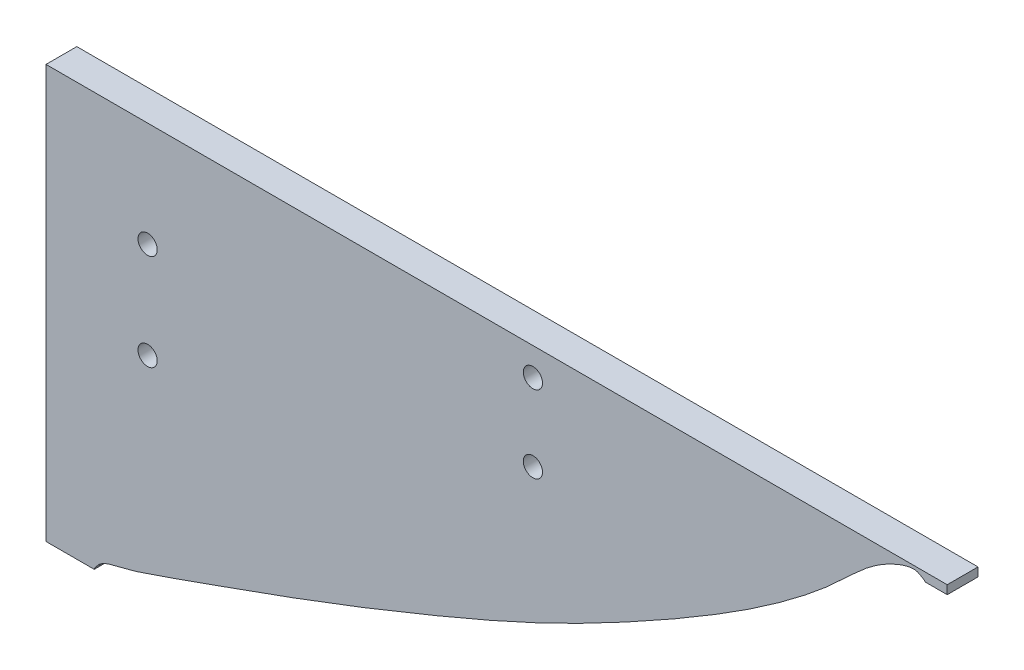
ISO-10303-21;
HEADER;
FILE_DESCRIPTION(('STEP AP214'),'2;1');
FILE_NAME('part.step','',(''),(''),'','','');
FILE_SCHEMA(('AUTOMOTIVE_DESIGN { 1 0 10303 214 1 1 1 1 }'));
ENDSEC;
DATA;
#1=APPLICATION_CONTEXT('core data for automotive mechanical design processes');
#2=APPLICATION_PROTOCOL_DEFINITION('international standard','automotive_design',2000,#1);
#3=PRODUCT_CONTEXT('',#1,'mechanical');
#4=PRODUCT('Part','Part','',(#3));
#5=PRODUCT_RELATED_PRODUCT_CATEGORY('part','',(#4));
#6=PRODUCT_DEFINITION_FORMATION('','',#4);
#7=PRODUCT_DEFINITION_CONTEXT('part definition',#1,'design');
#8=PRODUCT_DEFINITION('design','',#6,#7);
#9=PRODUCT_DEFINITION_SHAPE('','',#8);
#10=(LENGTH_UNIT() NAMED_UNIT(*) SI_UNIT(.MILLI.,.METRE.));
#11=(NAMED_UNIT(*) PLANE_ANGLE_UNIT() SI_UNIT($,.RADIAN.));
#12=(NAMED_UNIT(*) SI_UNIT($,.STERADIAN.) SOLID_ANGLE_UNIT());
#13=UNCERTAINTY_MEASURE_WITH_UNIT(LENGTH_MEASURE(1.E-05),#10,'distance_accuracy_value','');
#14=(GEOMETRIC_REPRESENTATION_CONTEXT(3) GLOBAL_UNCERTAINTY_ASSIGNED_CONTEXT((#13)) GLOBAL_UNIT_ASSIGNED_CONTEXT((#10,
#11,#12)) REPRESENTATION_CONTEXT('',''));
#15=CARTESIAN_POINT('',(0.,0.,0.));
#16=DIRECTION('',(0.,0.,1.));
#17=DIRECTION('',(1.,0.,0.));
#18=AXIS2_PLACEMENT_3D('',#15,#16,#17);
#19=CARTESIAN_POINT('',(-1.09676969661003,-60.6407839002525,148.));
#20=DIRECTION('',(0.,0.,-1.));
#21=DIRECTION('',(-1.,0.,0.));
#22=AXIS2_PLACEMENT_3D('',#19,#20,#21);
#23=PLANE('',#22);
#24=CARTESIAN_POINT('',(-100.,-50.,148.));
#25=DIRECTION('',(0.,0.,-1.));
#26=DIRECTION('',(-1.,0.,0.));
#27=AXIS2_PLACEMENT_3D('',#24,#25,#26);
#28=CIRCLE('',#27,2.5);
#29=CARTESIAN_POINT('',(-102.5,-50.,148.));
#30=VERTEX_POINT('',#29);
#31=EDGE_CURVE('E249',#30,#30,#28,.F.);
#32=ORIENTED_EDGE('',*,*,#31,.F.);
#33=EDGE_LOOP('',(#32));
#34=FACE_BOUND('',#33,.T.);
#35=CARTESIAN_POINT('',(0.0705666698621599,-4.96037406111782,148.));
#36=DIRECTION('',(0.,0.,-1.));
#37=DIRECTION('',(-1.,0.,0.));
#38=AXIS2_PLACEMENT_3D('',#35,#36,#37);
#39=CIRCLE('',#38,2.5);
#40=CARTESIAN_POINT('',(-2.42943333013784,-4.96037406111782,148.));
#41=VERTEX_POINT('',#40);
#42=EDGE_CURVE('E159',#41,#41,#39,.F.);
#43=ORIENTED_EDGE('',*,*,#42,.F.);
#44=EDGE_LOOP('',(#43));
#45=FACE_BOUND('',#44,.T.);
#46=DIRECTION('',(0.,1.,0.));
#47=VECTOR('',#46,1.);
#48=CARTESIAN_POINT('',(107.675052802165,2.25600000000004,148.));
#49=LINE('',#48,#47);
#50=CARTESIAN_POINT('',(107.675052802165,0.,148.));
#51=VERTEX_POINT('',#50);
#52=CARTESIAN_POINT('',(107.675052802165,2.25600000000004,148.));
#53=VERTEX_POINT('',#52);
#54=EDGE_CURVE('E211',#51,#53,#49,.T.);
#55=ORIENTED_EDGE('',*,*,#54,.T.);
#56=DIRECTION('',(-1.,0.,0.));
#57=VECTOR('',#56,1.);
#58=CARTESIAN_POINT('',(107.675052802165,2.25600000000004,148.));
#59=LINE('',#58,#57);
#60=CARTESIAN_POINT('',(-126.390677196792,2.25600000000001,148.));
#61=VERTEX_POINT('',#60);
#62=EDGE_CURVE('E87',#53,#61,#59,.T.);
#63=ORIENTED_EDGE('',*,*,#62,.T.);
#64=DIRECTION('',(0.,-1.,0.));
#65=VECTOR('',#64,1.);
#66=CARTESIAN_POINT('',(-126.390677196792,-105.065726114044,148.));
#67=LINE('',#66,#65);
#68=CARTESIAN_POINT('',(-126.390677196792,-105.065726114044,148.));
#69=VERTEX_POINT('',#68);
#70=EDGE_CURVE('E102',#61,#69,#67,.T.);
#71=ORIENTED_EDGE('',*,*,#70,.T.);
#72=CARTESIAN_POINT('',(-113.860400232549,-105.062774821914,148.));
#73=CARTESIAN_POINT('',(-118.037159155929,-105.064002939112,148.));
#74=CARTESIAN_POINT('',(-122.213918161355,-105.064969676944,148.));
#75=CARTESIAN_POINT('',(-126.390677196792,-105.065726114044,148.));
#76=B_SPLINE_CURVE_WITH_KNOTS('',3,(#72,#73,#74,#75),.UNSPECIFIED.,.F.,.F.,(4,4),(0.,1.),.UNSPECIFIED.);
#77=CARTESIAN_POINT('',(-113.860400232549,-105.062774821914,148.));
#78=VERTEX_POINT('',#77);
#79=EDGE_CURVE('E94',#69,#78,#76,.F.);
#80=ORIENTED_EDGE('',*,*,#79,.T.);
#81=CARTESIAN_POINT('',(102.004591341059,0.,148.));
#82=CARTESIAN_POINT('',(101.965315272963,0.0724784232057464,148.));
#83=CARTESIAN_POINT('',(101.914383307778,0.137900322384781,148.));
#84=CARTESIAN_POINT('',(101.799090362381,0.252292918866348,148.));
#85=CARTESIAN_POINT('',(101.733966005,0.302926518615552,148.));
#86=CARTESIAN_POINT('',(101.531242490825,0.442845408953407,148.));
#87=CARTESIAN_POINT('',(101.388683242925,0.523375335773517,148.));
#88=CARTESIAN_POINT('',(101.105210247475,0.687266276796375,148.));
#89=CARTESIAN_POINT('',(100.965329546077,0.77240464943584,148.));
#90=CARTESIAN_POINT('',(100.681572962878,0.935807677042208,148.));
#91=CARTESIAN_POINT('',(100.537010264991,1.01314088848754,148.));
#92=CARTESIAN_POINT('',(100.240664976997,1.15435548651139,148.));
#93=CARTESIAN_POINT('',(100.090478552917,1.21807912940542,148.));
#94=CARTESIAN_POINT('',(99.78242242208,1.31926283445655,148.));
#95=CARTESIAN_POINT('',(99.6243324421509,1.35596994211569,148.));
#96=CARTESIAN_POINT('',(99.3011117349166,1.40531693968947,148.));
#97=CARTESIAN_POINT('',(99.1359049221367,1.41768884367164,148.));
#98=CARTESIAN_POINT('',(98.8098410503189,1.4227713389828,148.));
#99=CARTESIAN_POINT('',(98.6475184629352,1.41576143865461,148.));
#100=CARTESIAN_POINT('',(98.1620322512366,1.37478314100997,148.));
#101=CARTESIAN_POINT('',(97.83938878254,1.32092261020247,148.));
#102=CARTESIAN_POINT('',(97.2004725314163,1.18604983894369,148.));
#103=CARTESIAN_POINT('',(96.8858693977255,1.1060104751807,148.));
#104=CARTESIAN_POINT('',(95.9549344143912,0.832471935508672,148.));
#105=CARTESIAN_POINT('',(95.3510025484281,0.606783885275898,148.));
#106=CARTESIAN_POINT('',(94.1584628637978,0.115628391123793,148.));
#107=CARTESIAN_POINT('',(93.5706063876763,-0.151789448167041,148.));
#108=CARTESIAN_POINT('',(92.4099097671509,-0.725605727603896,148.));
#109=CARTESIAN_POINT('',(91.8366506172828,-1.03169358376253,148.));
#110=CARTESIAN_POINT('',(90.158803132241,-1.99085812372679,148.));
#111=CARTESIAN_POINT('',(89.089893397803,-2.69060228003214,148.));
#112=CARTESIAN_POINT('',(86.0240882843242,-4.96097235991696,148.));
#113=CARTESIAN_POINT('',(84.1553806219713,-6.6872688974791,148.));
#114=CARTESIAN_POINT('',(81.3769956354665,-9.30668074823709,148.));
#115=CARTESIAN_POINT('',(80.4536625819775,-10.183212602228,148.));
#116=CARTESIAN_POINT('',(78.588246646085,-11.9135065983015,148.));
#117=CARTESIAN_POINT('',(77.6481200091037,-12.7696443964442,148.));
#118=CARTESIAN_POINT('',(74.7876369086188,-15.2893566492977,148.));
#119=CARTESIAN_POINT('',(72.8288295359083,-16.9022316390941,148.));
#120=CARTESIAN_POINT('',(68.8507481842957,-20.0347894610945,148.));
#121=CARTESIAN_POINT('',(66.8302566084813,-21.5558727560338,148.));
#122=CARTESIAN_POINT('',(62.7424837408477,-24.5308015231601,148.));
#123=CARTESIAN_POINT('',(60.6742179219218,-25.9832322088351,148.));
#124=CARTESIAN_POINT('',(56.489449733714,-28.8187766255218,148.));
#125=CARTESIAN_POINT('',(54.3736469590613,-30.2028956889803,148.));
#126=CARTESIAN_POINT('',(50.1054227297494,-32.9185119894373,148.));
#127=CARTESIAN_POINT('',(47.9530832235602,-34.2501269881404,148.));
#128=CARTESIAN_POINT('',(43.6217482162883,-36.8750517507005,148.));
#129=CARTESIAN_POINT('',(41.442376741776,-38.1682202151548,148.));
#130=CARTESIAN_POINT('',(34.8768176649073,-41.9955061557634,148.));
#131=CARTESIAN_POINT('',(30.4609761788429,-44.478865870231,148.));
#132=CARTESIAN_POINT('',(21.5645076112454,-49.3317754514073,148.));
#133=CARTESIAN_POINT('',(17.0866882075677,-51.7015600472922,148.));
#134=CARTESIAN_POINT('',(8.05341965906945,-56.2922061437056,148.));
#135=CARTESIAN_POINT('',(3.49593134031132,-58.5081645244224,148.));
#136=CARTESIAN_POINT('',(-5.68947073353152,-62.7734032760826,148.));
#137=CARTESIAN_POINT('',(-10.3186167208558,-64.8242638579789,148.));
#138=CARTESIAN_POINT('',(-19.622986305277,-68.8226167976224,148.));
#139=CARTESIAN_POINT('',(-24.2966511528051,-70.7743430770935,148.));
#140=CARTESIAN_POINT('',(-33.6694027611083,-74.617540658826,148.));
#141=CARTESIAN_POINT('',(-38.3679002437653,-76.5079915849037,148.));
#142=CARTESIAN_POINT('',(-47.7943019880841,-80.2133297784528,148.));
#143=CARTESIAN_POINT('',(-52.5229614543422,-82.0262764722125,148.));
#144=CARTESIAN_POINT('',(-62.0093199535055,-85.5775497899908,148.));
#145=CARTESIAN_POINT('',(-66.7669201558877,-87.3164401374762,148.));
#146=CARTESIAN_POINT('',(-76.2960014047332,-90.7545953059093,148.));
#147=CARTESIAN_POINT('',(-81.0669311203623,-92.4559745192209,148.));
#148=CARTESIAN_POINT('',(-88.2253512747538,-95.0022343288285,148.));
#149=CARTESIAN_POINT('',(-90.6122319333642,-95.8489052881763,148.));
#150=CARTESIAN_POINT('',(-94.1957634132361,-97.1097890444109,148.));
#151=CARTESIAN_POINT('',(-95.3908171892846,-97.5285418428142,148.));
#152=CARTESIAN_POINT('',(-97.7820456506576,-98.3628664011394,148.));
#153=CARTESIAN_POINT('',(-98.9771589516939,-98.7815629802371,148.));
#154=CARTESIAN_POINT('',(-101.374633743575,-99.5969371166741,148.));
#155=CARTESIAN_POINT('',(-102.578257891956,-99.9897877405964,148.));
#156=CARTESIAN_POINT('',(-104.401843709428,-100.523960526278,148.));
#157=CARTESIAN_POINT('',(-105.012609372192,-100.693187534995,148.));
#158=CARTESIAN_POINT('',(-106.240109409171,-101.012162072287,148.));
#159=CARTESIAN_POINT('',(-106.857856839831,-101.158825284782,148.));
#160=CARTESIAN_POINT('',(-108.096139908331,-101.443206891494,148.));
#161=CARTESIAN_POINT('',(-108.715302487179,-101.585330181894,148.));
#162=CARTESIAN_POINT('',(-109.631528596932,-101.838673207604,148.));
#163=CARTESIAN_POINT('',(-109.934921781174,-101.92958684828,148.));
#164=CARTESIAN_POINT('',(-110.535297060651,-102.131981477183,148.));
#165=CARTESIAN_POINT('',(-110.832228085496,-102.243626303794,148.));
#166=CARTESIAN_POINT('',(-111.413966440903,-102.505809853772,148.));
#167=CARTESIAN_POINT('',(-111.698879264093,-102.656010147341,148.));
#168=CARTESIAN_POINT('',(-112.110996489022,-102.930240400898,148.));
#169=CARTESIAN_POINT('',(-112.245354378792,-103.029869876848,148.));
#170=CARTESIAN_POINT('',(-112.497455509253,-103.241250694073,148.));
#171=CARTESIAN_POINT('',(-112.616580271027,-103.353611999932,148.));
#172=CARTESIAN_POINT('',(-112.846035595939,-103.586805137248,148.));
#173=CARTESIAN_POINT('',(-112.956257211779,-103.707741906166,148.));
#174=CARTESIAN_POINT('',(-113.167938977632,-103.958054441533,148.));
#175=CARTESIAN_POINT('',(-113.269549423382,-104.087285443923,148.));
#176=CARTESIAN_POINT('',(-113.47280121148,-104.345717689262,148.));
#177=CARTESIAN_POINT('',(-113.573897483955,-104.476156102827,148.));
#178=CARTESIAN_POINT('',(-113.752932284422,-104.752036806543,148.));
#179=CARTESIAN_POINT('',(-113.830752454926,-104.899623822889,148.));
#180=CARTESIAN_POINT('',(-113.860400232549,-105.062774821914,148.));
#181=B_SPLINE_CURVE_WITH_KNOTS('',3,(#81,#82,#83,#84,#85,#86,#87,#88,#89,#90,#91,#92,#93,#94,
#95,#96,#97,#98,#99,#100,#101,#102,#103,#104,#105,#106,#107,#108,#109,#110,#111,#112,#113,#114,
#115,#116,#117,#118,#119,#120,#121,#122,#123,#124,#125,#126,#127,#128,#129,#130,#131,#132,#133,
#134,#135,#136,#137,#138,#139,#140,#141,#142,#143,#144,#145,#146,#147,#148,#149,#150,#151,#152,
#153,#154,#155,#156,#157,#158,#159,#160,#161,#162,#163,#164,#165,#166,#167,#168,#169,#170,#171,
#172,#173,#174,#175,#176,#177,#178,#179,#180),.UNSPECIFIED.,.F.,.F.,(4,2,2,2,2,2,2,2,2,2,2,2,2,
2,2,2,2,2,2,2,2,2,2,2,2,2,2,2,2,2,2,2,2,2,2,2,2,2,2,2,2,2,2,2,2,2,2,2,2,4),(0.,0.0009765625,
0.00195312500000011,0.00390625000000011,0.00585937500000022,0.00781250000000033,
0.00976562500000033,0.0117187500000004,0.0136718750000006,0.0156250000000006,0.0195312500000006,
0.0234375000000006,0.0312500000000006,0.0390625000000004,0.0468750000000004,0.0625000000000003,
0.0937500000000003,0.109375,0.125,0.15625,0.1875,0.21875,0.25,0.28125,0.3125,0.375,0.4375,0.5,
0.5625,0.625,0.6875,0.75,0.8125,0.875,0.90625,0.921875,0.9375,0.953125,0.9609375,0.96875,
0.9765625,0.98046875,0.984375,0.98828125,0.990234375,0.9921875,0.994140625,0.99609375,
0.998046875,1.),.UNSPECIFIED.);
#182=CARTESIAN_POINT('',(102.004591341059,0.,148.));
#183=VERTEX_POINT('',#182);
#184=EDGE_CURVE('E99',#78,#183,#181,.F.);
#185=ORIENTED_EDGE('',*,*,#184,.T.);
#186=DIRECTION('',(1.,0.,0.));
#187=VECTOR('',#186,1.);
#188=CARTESIAN_POINT('',(102.004591341059,0.,148.));
#189=LINE('',#188,#187);
#190=EDGE_CURVE('E49',#183,#51,#189,.T.);
#191=ORIENTED_EDGE('',*,*,#190,.T.);
#192=EDGE_LOOP('',(#55,#63,#71,#80,#185,#191));
#193=FACE_BOUND('',#192,.T.);
#194=CARTESIAN_POINT('',(0.0705666698621599,-25.,148.));
#195=DIRECTION('',(0.,0.,-1.));
#196=DIRECTION('',(-1.,0.,0.));
#197=AXIS2_PLACEMENT_3D('',#194,#195,#196);
#198=CIRCLE('',#197,2.5);
#199=CARTESIAN_POINT('',(-2.42943333013784,-25.,148.));
#200=VERTEX_POINT('',#199);
#201=EDGE_CURVE('E256',#200,#200,#198,.F.);
#202=ORIENTED_EDGE('',*,*,#201,.F.);
#203=EDGE_LOOP('',(#202));
#204=FACE_BOUND('',#203,.T.);
#205=CARTESIAN_POINT('',(-100.,-25.,148.));
#206=DIRECTION('',(0.,0.,-1.));
#207=DIRECTION('',(-1.,0.,0.));
#208=AXIS2_PLACEMENT_3D('',#205,#206,#207);
#209=CIRCLE('',#208,2.5);
#210=CARTESIAN_POINT('',(-102.5,-25.,148.));
#211=VERTEX_POINT('',#210);
#212=EDGE_CURVE('E279',#211,#211,#209,.F.);
#213=ORIENTED_EDGE('',*,*,#212,.F.);
#214=EDGE_LOOP('',(#213));
#215=FACE_BOUND('',#214,.T.);
#216=ADVANCED_FACE('F30',(#34,#45,#193,#204,#215),#23,.F.);
#217=CARTESIAN_POINT('',(-1.09676969661003,-60.6407839002525,140.));
#218=DIRECTION('',(0.,0.,-1.));
#219=DIRECTION('',(-1.,0.,0.));
#220=AXIS2_PLACEMENT_3D('',#217,#218,#219);
#221=PLANE('',#220);
#222=CARTESIAN_POINT('',(-100.,-50.,140.));
#223=DIRECTION('',(0.,0.,-1.));
#224=DIRECTION('',(-1.,0.,0.));
#225=AXIS2_PLACEMENT_3D('',#222,#223,#224);
#226=CIRCLE('',#225,2.5);
#227=CARTESIAN_POINT('',(-102.5,-50.,140.));
#228=VERTEX_POINT('',#227);
#229=EDGE_CURVE('E278',#228,#228,#226,.F.);
#230=ORIENTED_EDGE('',*,*,#229,.T.);
#231=EDGE_LOOP('',(#230));
#232=FACE_BOUND('',#231,.T.);
#233=CARTESIAN_POINT('',(0.0705666698621599,-4.96037406111782,140.));
#234=DIRECTION('',(0.,0.,-1.));
#235=DIRECTION('',(-1.,0.,0.));
#236=AXIS2_PLACEMENT_3D('',#233,#234,#235);
#237=CIRCLE('',#236,2.5);
#238=CARTESIAN_POINT('',(-2.42943333013784,-4.96037406111782,140.));
#239=VERTEX_POINT('',#238);
#240=EDGE_CURVE('E253',#239,#239,#237,.F.);
#241=ORIENTED_EDGE('',*,*,#240,.T.);
#242=EDGE_LOOP('',(#241));
#243=FACE_BOUND('',#242,.T.);
#244=DIRECTION('',(0.,1.,0.));
#245=VECTOR('',#244,1.);
#246=CARTESIAN_POINT('',(107.675052802165,2.25600000000004,140.));
#247=LINE('',#246,#245);
#248=CARTESIAN_POINT('',(107.675052802165,0.,140.));
#249=VERTEX_POINT('',#248);
#250=CARTESIAN_POINT('',(107.675052802165,2.25600000000004,140.));
#251=VERTEX_POINT('',#250);
#252=EDGE_CURVE('E152',#249,#251,#247,.T.);
#253=ORIENTED_EDGE('',*,*,#252,.F.);
#254=DIRECTION('',(1.,0.,0.));
#255=VECTOR('',#254,1.);
#256=CARTESIAN_POINT('',(102.004591341059,0.,140.));
#257=LINE('',#256,#255);
#258=CARTESIAN_POINT('',(102.004591341059,0.,140.));
#259=VERTEX_POINT('',#258);
#260=EDGE_CURVE('E79',#259,#249,#257,.T.);
#261=ORIENTED_EDGE('',*,*,#260,.F.);
#262=CARTESIAN_POINT('',(-113.860400232549,-105.062774821914,140.));
#263=CARTESIAN_POINT('',(-113.830752454926,-104.899623822889,140.));
#264=CARTESIAN_POINT('',(-113.752932284422,-104.752036806543,140.));
#265=CARTESIAN_POINT('',(-113.573897483955,-104.476156102827,140.));
#266=CARTESIAN_POINT('',(-113.47280121148,-104.345717689262,140.));
#267=CARTESIAN_POINT('',(-113.269549423382,-104.087285443923,140.));
#268=CARTESIAN_POINT('',(-113.167938977632,-103.958054441533,140.));
#269=CARTESIAN_POINT('',(-112.956257211779,-103.707741906166,140.));
#270=CARTESIAN_POINT('',(-112.846035595939,-103.586805137248,140.));
#271=CARTESIAN_POINT('',(-112.616580271027,-103.353611999932,140.));
#272=CARTESIAN_POINT('',(-112.497455509253,-103.241250694073,140.));
#273=CARTESIAN_POINT('',(-112.245354378792,-103.029869876848,140.));
#274=CARTESIAN_POINT('',(-112.110996489022,-102.930240400898,140.));
#275=CARTESIAN_POINT('',(-111.698879264093,-102.656010147341,140.));
#276=CARTESIAN_POINT('',(-111.413966440903,-102.505809853772,140.));
#277=CARTESIAN_POINT('',(-110.832228085496,-102.243626303794,140.));
#278=CARTESIAN_POINT('',(-110.535297060651,-102.131981477183,140.));
#279=CARTESIAN_POINT('',(-109.934921781174,-101.92958684828,140.));
#280=CARTESIAN_POINT('',(-109.631528596932,-101.838673207604,140.));
#281=CARTESIAN_POINT('',(-108.715302487179,-101.585330181894,140.));
#282=CARTESIAN_POINT('',(-108.096139908331,-101.443206891494,140.));
#283=CARTESIAN_POINT('',(-106.857856839831,-101.158825284782,140.));
#284=CARTESIAN_POINT('',(-106.240109409171,-101.012162072287,140.));
#285=CARTESIAN_POINT('',(-105.012609372192,-100.693187534995,140.));
#286=CARTESIAN_POINT('',(-104.401843709428,-100.523960526278,140.));
#287=CARTESIAN_POINT('',(-102.578257891956,-99.9897877405964,140.));
#288=CARTESIAN_POINT('',(-101.374633743575,-99.5969371166741,140.));
#289=CARTESIAN_POINT('',(-98.9771589516939,-98.7815629802371,140.));
#290=CARTESIAN_POINT('',(-97.7820456506576,-98.3628664011394,140.));
#291=CARTESIAN_POINT('',(-95.3908171892846,-97.5285418428142,140.));
#292=CARTESIAN_POINT('',(-94.1957634132361,-97.1097890444109,140.));
#293=CARTESIAN_POINT('',(-90.6122319333642,-95.8489052881763,140.));
#294=CARTESIAN_POINT('',(-88.2253512747538,-95.0022343288285,140.));
#295=CARTESIAN_POINT('',(-81.0669311203623,-92.4559745192209,140.));
#296=CARTESIAN_POINT('',(-76.2960014047332,-90.7545953059093,140.));
#297=CARTESIAN_POINT('',(-66.7669201558877,-87.3164401374762,140.));
#298=CARTESIAN_POINT('',(-62.0093199535055,-85.5775497899908,140.));
#299=CARTESIAN_POINT('',(-52.5229614543422,-82.0262764722125,140.));
#300=CARTESIAN_POINT('',(-47.7943019880841,-80.2133297784528,140.));
#301=CARTESIAN_POINT('',(-38.3679002437653,-76.5079915849037,140.));
#302=CARTESIAN_POINT('',(-33.6694027611083,-74.617540658826,140.));
#303=CARTESIAN_POINT('',(-24.2966511528051,-70.7743430770935,140.));
#304=CARTESIAN_POINT('',(-19.622986305277,-68.8226167976224,140.));
#305=CARTESIAN_POINT('',(-10.3186167208558,-64.8242638579789,140.));
#306=CARTESIAN_POINT('',(-5.68947073353152,-62.7734032760826,140.));
#307=CARTESIAN_POINT('',(3.49593134031132,-58.5081645244224,140.));
#308=CARTESIAN_POINT('',(8.05341965906945,-56.2922061437056,140.));
#309=CARTESIAN_POINT('',(17.0866882075677,-51.7015600472922,140.));
#310=CARTESIAN_POINT('',(21.5645076112454,-49.3317754514073,140.));
#311=CARTESIAN_POINT('',(30.4609761788429,-44.478865870231,140.));
#312=CARTESIAN_POINT('',(34.8768176649073,-41.9955061557634,140.));
#313=CARTESIAN_POINT('',(41.442376741776,-38.1682202151548,140.));
#314=CARTESIAN_POINT('',(43.6217482162883,-36.8750517507005,140.));
#315=CARTESIAN_POINT('',(47.9530832235602,-34.2501269881404,140.));
#316=CARTESIAN_POINT('',(50.1054227297494,-32.9185119894373,140.));
#317=CARTESIAN_POINT('',(54.3736469590613,-30.2028956889803,140.));
#318=CARTESIAN_POINT('',(56.489449733714,-28.8187766255218,140.));
#319=CARTESIAN_POINT('',(60.6742179219218,-25.9832322088351,140.));
#320=CARTESIAN_POINT('',(62.7424837408477,-24.5308015231601,140.));
#321=CARTESIAN_POINT('',(66.8302566084813,-21.5558727560338,140.));
#322=CARTESIAN_POINT('',(68.8507481842957,-20.0347894610945,140.));
#323=CARTESIAN_POINT('',(72.8288295359083,-16.9022316390941,140.));
#324=CARTESIAN_POINT('',(74.7876369086188,-15.2893566492977,140.));
#325=CARTESIAN_POINT('',(77.6481200091037,-12.7696443964442,140.));
#326=CARTESIAN_POINT('',(78.588246646085,-11.9135065983015,140.));
#327=CARTESIAN_POINT('',(80.4536625819775,-10.183212602228,140.));
#328=CARTESIAN_POINT('',(81.3769956354665,-9.30668074823709,140.));
#329=CARTESIAN_POINT('',(84.1553806219713,-6.6872688974791,140.));
#330=CARTESIAN_POINT('',(86.0240882843242,-4.96097235991696,140.));
#331=CARTESIAN_POINT('',(89.089893397803,-2.69060228003214,140.));
#332=CARTESIAN_POINT('',(90.158803132241,-1.99085812372679,140.));
#333=CARTESIAN_POINT('',(91.8366506172828,-1.03169358376253,140.));
#334=CARTESIAN_POINT('',(92.4099097671509,-0.725605727603896,140.));
#335=CARTESIAN_POINT('',(93.5706063876763,-0.151789448167041,140.));
#336=CARTESIAN_POINT('',(94.1584628637978,0.115628391123793,140.));
#337=CARTESIAN_POINT('',(95.3510025484281,0.606783885275898,140.));
#338=CARTESIAN_POINT('',(95.9549344143912,0.832471935508672,140.));
#339=CARTESIAN_POINT('',(96.8858693977255,1.1060104751807,140.));
#340=CARTESIAN_POINT('',(97.2004725314163,1.18604983894369,140.));
#341=CARTESIAN_POINT('',(97.83938878254,1.32092261020247,140.));
#342=CARTESIAN_POINT('',(98.1620322512366,1.37478314100997,140.));
#343=CARTESIAN_POINT('',(98.6475184629352,1.41576143865461,140.));
#344=CARTESIAN_POINT('',(98.8098410503189,1.4227713389828,140.));
#345=CARTESIAN_POINT('',(99.1359049221367,1.41768884367164,140.));
#346=CARTESIAN_POINT('',(99.3011117349166,1.40531693968947,140.));
#347=CARTESIAN_POINT('',(99.6243324421509,1.35596994211569,140.));
#348=CARTESIAN_POINT('',(99.78242242208,1.31926283445655,140.));
#349=CARTESIAN_POINT('',(100.090478552917,1.21807912940542,140.));
#350=CARTESIAN_POINT('',(100.240664976997,1.15435548651139,140.));
#351=CARTESIAN_POINT('',(100.537010264991,1.01314088848754,140.));
#352=CARTESIAN_POINT('',(100.681572962878,0.935807677042208,140.));
#353=CARTESIAN_POINT('',(100.965329546077,0.77240464943584,140.));
#354=CARTESIAN_POINT('',(101.105210247475,0.687266276796375,140.));
#355=CARTESIAN_POINT('',(101.388683242925,0.523375335773517,140.));
#356=CARTESIAN_POINT('',(101.531242490825,0.442845408953407,140.));
#357=CARTESIAN_POINT('',(101.733966005,0.302926518615552,140.));
#358=CARTESIAN_POINT('',(101.799090362381,0.252292918866348,140.));
#359=CARTESIAN_POINT('',(101.914383307778,0.137900322384781,140.));
#360=CARTESIAN_POINT('',(101.965315272963,0.0724784232057464,140.));
#361=CARTESIAN_POINT('',(102.004591341059,0.,140.));
#362=B_SPLINE_CURVE_WITH_KNOTS('',3,(#262,#263,#264,#265,#266,#267,#268,#269,#270,#271,#272,
#273,#274,#275,#276,#277,#278,#279,#280,#281,#282,#283,#284,#285,#286,#287,#288,#289,#290,#291,
#292,#293,#294,#295,#296,#297,#298,#299,#300,#301,#302,#303,#304,#305,#306,#307,#308,#309,#310,
#311,#312,#313,#314,#315,#316,#317,#318,#319,#320,#321,#322,#323,#324,#325,#326,#327,#328,#329,
#330,#331,#332,#333,#334,#335,#336,#337,#338,#339,#340,#341,#342,#343,#344,#345,#346,#347,#348,
#349,#350,#351,#352,#353,#354,#355,#356,#357,#358,#359,#360,#361),.UNSPECIFIED.,.F.,.F.,(4,2,2,
2,2,2,2,2,2,2,2,2,2,2,2,2,2,2,2,2,2,2,2,2,2,2,2,2,2,2,2,2,2,2,2,2,2,2,2,2,2,2,2,2,2,2,2,2,2,4),
(0.,0.001953125,0.00390624999999989,0.00585937499999989,0.00781249999999989,0.00976562499999978,
0.0117187499999998,0.0156249999999997,0.0195312499999997,0.0234374999999996,0.0312499999999997,
0.0390624999999997,0.0468749999999998,0.0624999999999998,0.0781249999999999,0.0937499999999999,
0.125,0.1875,0.25,0.3125,0.375,0.4375,0.5,0.5625,0.625,0.6875,0.71875,0.75,0.78125,0.8125,
0.84375,0.875,0.890625,0.90625,0.9375,0.953125,0.9609375,0.968749999999999,0.976562499999999,
0.980468749999999,0.984374999999999,0.986328124999999,0.98828125,0.990234375,0.9921875,
0.994140625,0.99609375,0.998046875,0.9990234375,1.),.UNSPECIFIED.);
#363=CARTESIAN_POINT('',(-113.860400232549,-105.062774821914,140.));
#364=VERTEX_POINT('',#363);
#365=EDGE_CURVE('E72',#364,#259,#362,.T.);
#366=ORIENTED_EDGE('',*,*,#365,.F.);
#367=CARTESIAN_POINT('',(-126.390677196792,-105.065726114044,140.));
#368=CARTESIAN_POINT('',(-122.213918161355,-105.064969676944,140.));
#369=CARTESIAN_POINT('',(-118.037159155929,-105.064002939112,140.));
#370=CARTESIAN_POINT('',(-113.860400232549,-105.062774821914,140.));
#371=B_SPLINE_CURVE_WITH_KNOTS('',3,(#367,#368,#369,#370),.UNSPECIFIED.,.F.,.F.,(4,4),(0.,1.),.UNSPECIFIED.);
#372=CARTESIAN_POINT('',(-126.390677196792,-105.065726114044,140.));
#373=VERTEX_POINT('',#372);
#374=EDGE_CURVE('E112',#373,#364,#371,.T.);
#375=ORIENTED_EDGE('',*,*,#374,.F.);
#376=DIRECTION('',(0.,-1.,0.));
#377=VECTOR('',#376,1.);
#378=CARTESIAN_POINT('',(-126.390677196792,-105.065726114044,140.));
#379=LINE('',#378,#377);
#380=CARTESIAN_POINT('',(-126.390677196792,2.25600000000001,140.));
#381=VERTEX_POINT('',#380);
#382=EDGE_CURVE('E161',#381,#373,#379,.T.);
#383=ORIENTED_EDGE('',*,*,#382,.F.);
#384=DIRECTION('',(-1.,0.,0.));
#385=VECTOR('',#384,1.);
#386=CARTESIAN_POINT('',(107.675052802165,2.25600000000004,140.));
#387=LINE('',#386,#385);
#388=EDGE_CURVE('E158',#251,#381,#387,.T.);
#389=ORIENTED_EDGE('',*,*,#388,.F.);
#390=EDGE_LOOP('',(#253,#261,#366,#375,#383,#389));
#391=FACE_BOUND('',#390,.T.);
#392=CARTESIAN_POINT('',(0.0705666698621599,-25.,140.));
#393=DIRECTION('',(0.,0.,-1.));
#394=DIRECTION('',(-1.,0.,0.));
#395=AXIS2_PLACEMENT_3D('',#392,#393,#394);
#396=CIRCLE('',#395,2.5);
#397=CARTESIAN_POINT('',(-2.42943333013784,-25.,140.));
#398=VERTEX_POINT('',#397);
#399=EDGE_CURVE('E276',#398,#398,#396,.F.);
#400=ORIENTED_EDGE('',*,*,#399,.T.);
#401=EDGE_LOOP('',(#400));
#402=FACE_BOUND('',#401,.T.);
#403=CARTESIAN_POINT('',(-100.,-25.,140.));
#404=DIRECTION('',(0.,0.,-1.));
#405=DIRECTION('',(-1.,0.,0.));
#406=AXIS2_PLACEMENT_3D('',#403,#404,#405);
#407=CIRCLE('',#406,2.5);
#408=CARTESIAN_POINT('',(-102.5,-25.,140.));
#409=VERTEX_POINT('',#408);
#410=EDGE_CURVE('E34',#409,#409,#407,.F.);
#411=ORIENTED_EDGE('',*,*,#410,.T.);
#412=EDGE_LOOP('',(#411));
#413=FACE_BOUND('',#412,.T.);
#414=ADVANCED_FACE('F188',(#232,#243,#391,#402,#413),#221,.T.);
#415=CARTESIAN_POINT('',(107.675052802165,2.25600000000004,148.));
#416=DIRECTION('',(-1.,0.,0.));
#417=DIRECTION('',(0.,0.,1.));
#418=AXIS2_PLACEMENT_3D('',#415,#416,#417);
#419=PLANE('',#418);
#420=ORIENTED_EDGE('',*,*,#252,.T.);
#421=DIRECTION('',(0.,0.,-1.));
#422=VECTOR('',#421,1.);
#423=CARTESIAN_POINT('',(107.675052802165,2.25600000000004,148.));
#424=LINE('',#423,#422);
#425=EDGE_CURVE('E11',#53,#251,#424,.T.);
#426=ORIENTED_EDGE('',*,*,#425,.F.);
#427=ORIENTED_EDGE('',*,*,#54,.F.);
#428=DIRECTION('',(0.,0.,-1.));
#429=VECTOR('',#428,1.);
#430=CARTESIAN_POINT('',(107.675052802165,0.,148.));
#431=LINE('',#430,#429);
#432=EDGE_CURVE('E162',#51,#249,#431,.T.);
#433=ORIENTED_EDGE('',*,*,#432,.T.);
#434=EDGE_LOOP('',(#420,#426,#427,#433));
#435=FACE_BOUND('',#434,.T.);
#436=ADVANCED_FACE('F32',(#435),#419,.F.);
#437=CARTESIAN_POINT('',(107.675052802165,2.25600000000004,148.));
#438=DIRECTION('',(0.,-1.,0.));
#439=DIRECTION('',(1.,0.,0.));
#440=AXIS2_PLACEMENT_3D('',#437,#438,#439);
#441=PLANE('',#440);
#442=ORIENTED_EDGE('',*,*,#388,.T.);
#443=DIRECTION('',(0.,0.,-1.));
#444=VECTOR('',#443,1.);
#445=CARTESIAN_POINT('',(-126.390677196792,2.25600000000001,148.));
#446=LINE('',#445,#444);
#447=EDGE_CURVE('E40',#61,#381,#446,.T.);
#448=ORIENTED_EDGE('',*,*,#447,.F.);
#449=ORIENTED_EDGE('',*,*,#62,.F.);
#450=ORIENTED_EDGE('',*,*,#425,.T.);
#451=EDGE_LOOP('',(#442,#448,#449,#450));
#452=FACE_BOUND('',#451,.T.);
#453=ADVANCED_FACE('F218',(#452),#441,.F.);
#454=CARTESIAN_POINT('',(-126.390677196792,-105.065726114044,148.));
#455=DIRECTION('',(1.,0.,0.));
#456=DIRECTION('',(0.,1.,0.));
#457=AXIS2_PLACEMENT_3D('',#454,#455,#456);
#458=PLANE('',#457);
#459=ORIENTED_EDGE('',*,*,#382,.T.);
#460=DIRECTION('',(0.,0.,-1.));
#461=VECTOR('',#460,1.);
#462=CARTESIAN_POINT('',(-126.390677196792,-105.065726114044,148.));
#463=LINE('',#462,#461);
#464=EDGE_CURVE('E114',#69,#373,#463,.T.);
#465=ORIENTED_EDGE('',*,*,#464,.F.);
#466=ORIENTED_EDGE('',*,*,#70,.F.);
#467=ORIENTED_EDGE('',*,*,#447,.T.);
#468=EDGE_LOOP('',(#459,#465,#466,#467));
#469=FACE_BOUND('',#468,.T.);
#470=ADVANCED_FACE('F214',(#469),#458,.F.);
#471=CARTESIAN_POINT('',(-126.390677196792,-105.065726114044,148.));
#472=CARTESIAN_POINT('',(-122.213918161355,-105.064969676944,148.));
#473=CARTESIAN_POINT('',(-118.037159155929,-105.064002939112,148.));
#474=CARTESIAN_POINT('',(-113.860400232549,-105.062774821914,148.));
#475=B_SPLINE_CURVE_WITH_KNOTS('',3,(#471,#472,#473,#474),.UNSPECIFIED.,.F.,.F.,(4,4),(0.,1.),.UNSPECIFIED.);
#476=DIRECTION('',(0.,0.,-1.));
#477=VECTOR('',#476,1.);
#478=SURFACE_OF_LINEAR_EXTRUSION('',#475,#477);
#479=ORIENTED_EDGE('',*,*,#374,.T.);
#480=DIRECTION('',(0.,0.,-1.));
#481=VECTOR('',#480,1.);
#482=CARTESIAN_POINT('',(-113.860400232549,-105.062774821914,148.));
#483=LINE('',#482,#481);
#484=EDGE_CURVE('E109',#78,#364,#483,.T.);
#485=ORIENTED_EDGE('',*,*,#484,.F.);
#486=ORIENTED_EDGE('',*,*,#79,.F.);
#487=ORIENTED_EDGE('',*,*,#464,.T.);
#488=EDGE_LOOP('',(#479,#485,#486,#487));
#489=FACE_BOUND('',#488,.T.);
#490=ADVANCED_FACE('F110',(#489),#478,.F.);
#491=CARTESIAN_POINT('',(-113.860400232549,-105.062774821914,148.));
#492=CARTESIAN_POINT('',(-113.830752454926,-104.899623822889,148.));
#493=CARTESIAN_POINT('',(-113.752932284422,-104.752036806543,148.));
#494=CARTESIAN_POINT('',(-113.573897483955,-104.476156102827,148.));
#495=CARTESIAN_POINT('',(-113.47280121148,-104.345717689262,148.));
#496=CARTESIAN_POINT('',(-113.269549423382,-104.087285443923,148.));
#497=CARTESIAN_POINT('',(-113.167938977632,-103.958054441533,148.));
#498=CARTESIAN_POINT('',(-112.956257211779,-103.707741906166,148.));
#499=CARTESIAN_POINT('',(-112.846035595939,-103.586805137248,148.));
#500=CARTESIAN_POINT('',(-112.616580271027,-103.353611999932,148.));
#501=CARTESIAN_POINT('',(-112.497455509253,-103.241250694073,148.));
#502=CARTESIAN_POINT('',(-112.245354378792,-103.029869876848,148.));
#503=CARTESIAN_POINT('',(-112.110996489022,-102.930240400898,148.));
#504=CARTESIAN_POINT('',(-111.698879264093,-102.656010147341,148.));
#505=CARTESIAN_POINT('',(-111.413966440903,-102.505809853772,148.));
#506=CARTESIAN_POINT('',(-110.832228085496,-102.243626303794,148.));
#507=CARTESIAN_POINT('',(-110.535297060651,-102.131981477183,148.));
#508=CARTESIAN_POINT('',(-109.934921781174,-101.92958684828,148.));
#509=CARTESIAN_POINT('',(-109.631528596932,-101.838673207604,148.));
#510=CARTESIAN_POINT('',(-108.715302487179,-101.585330181894,148.));
#511=CARTESIAN_POINT('',(-108.096139908331,-101.443206891494,148.));
#512=CARTESIAN_POINT('',(-106.857856839831,-101.158825284782,148.));
#513=CARTESIAN_POINT('',(-106.240109409171,-101.012162072287,148.));
#514=CARTESIAN_POINT('',(-105.012609372192,-100.693187534995,148.));
#515=CARTESIAN_POINT('',(-104.401843709428,-100.523960526278,148.));
#516=CARTESIAN_POINT('',(-102.578257891956,-99.9897877405964,148.));
#517=CARTESIAN_POINT('',(-101.374633743575,-99.5969371166741,148.));
#518=CARTESIAN_POINT('',(-98.9771589516939,-98.7815629802371,148.));
#519=CARTESIAN_POINT('',(-97.7820456506576,-98.3628664011394,148.));
#520=CARTESIAN_POINT('',(-95.3908171892846,-97.5285418428142,148.));
#521=CARTESIAN_POINT('',(-94.1957634132361,-97.1097890444109,148.));
#522=CARTESIAN_POINT('',(-90.6122319333642,-95.8489052881763,148.));
#523=CARTESIAN_POINT('',(-88.2253512747538,-95.0022343288285,148.));
#524=CARTESIAN_POINT('',(-81.0669311203623,-92.4559745192209,148.));
#525=CARTESIAN_POINT('',(-76.2960014047332,-90.7545953059093,148.));
#526=CARTESIAN_POINT('',(-66.7669201558877,-87.3164401374762,148.));
#527=CARTESIAN_POINT('',(-62.0093199535055,-85.5775497899908,148.));
#528=CARTESIAN_POINT('',(-52.5229614543422,-82.0262764722125,148.));
#529=CARTESIAN_POINT('',(-47.7943019880841,-80.2133297784528,148.));
#530=CARTESIAN_POINT('',(-38.3679002437653,-76.5079915849037,148.));
#531=CARTESIAN_POINT('',(-33.6694027611083,-74.617540658826,148.));
#532=CARTESIAN_POINT('',(-24.2966511528051,-70.7743430770935,148.));
#533=CARTESIAN_POINT('',(-19.622986305277,-68.8226167976224,148.));
#534=CARTESIAN_POINT('',(-10.3186167208558,-64.8242638579789,148.));
#535=CARTESIAN_POINT('',(-5.68947073353152,-62.7734032760826,148.));
#536=CARTESIAN_POINT('',(3.49593134031132,-58.5081645244224,148.));
#537=CARTESIAN_POINT('',(8.05341965906945,-56.2922061437056,148.));
#538=CARTESIAN_POINT('',(17.0866882075677,-51.7015600472922,148.));
#539=CARTESIAN_POINT('',(21.5645076112454,-49.3317754514073,148.));
#540=CARTESIAN_POINT('',(30.4609761788429,-44.478865870231,148.));
#541=CARTESIAN_POINT('',(34.8768176649073,-41.9955061557634,148.));
#542=CARTESIAN_POINT('',(41.442376741776,-38.1682202151548,148.));
#543=CARTESIAN_POINT('',(43.6217482162883,-36.8750517507005,148.));
#544=CARTESIAN_POINT('',(47.9530832235602,-34.2501269881404,148.));
#545=CARTESIAN_POINT('',(50.1054227297494,-32.9185119894373,148.));
#546=CARTESIAN_POINT('',(54.3736469590613,-30.2028956889803,148.));
#547=CARTESIAN_POINT('',(56.489449733714,-28.8187766255218,148.));
#548=CARTESIAN_POINT('',(60.6742179219218,-25.9832322088351,148.));
#549=CARTESIAN_POINT('',(62.7424837408477,-24.5308015231601,148.));
#550=CARTESIAN_POINT('',(66.8302566084813,-21.5558727560338,148.));
#551=CARTESIAN_POINT('',(68.8507481842957,-20.0347894610945,148.));
#552=CARTESIAN_POINT('',(72.8288295359083,-16.9022316390941,148.));
#553=CARTESIAN_POINT('',(74.7876369086188,-15.2893566492977,148.));
#554=CARTESIAN_POINT('',(77.6481200091037,-12.7696443964442,148.));
#555=CARTESIAN_POINT('',(78.588246646085,-11.9135065983015,148.));
#556=CARTESIAN_POINT('',(80.4536625819775,-10.183212602228,148.));
#557=CARTESIAN_POINT('',(81.3769956354665,-9.30668074823709,148.));
#558=CARTESIAN_POINT('',(84.1553806219713,-6.6872688974791,148.));
#559=CARTESIAN_POINT('',(86.0240882843242,-4.96097235991696,148.));
#560=CARTESIAN_POINT('',(89.089893397803,-2.69060228003214,148.));
#561=CARTESIAN_POINT('',(90.158803132241,-1.99085812372679,148.));
#562=CARTESIAN_POINT('',(91.8366506172828,-1.03169358376253,148.));
#563=CARTESIAN_POINT('',(92.4099097671509,-0.725605727603896,148.));
#564=CARTESIAN_POINT('',(93.5706063876763,-0.151789448167041,148.));
#565=CARTESIAN_POINT('',(94.1584628637978,0.115628391123793,148.));
#566=CARTESIAN_POINT('',(95.3510025484281,0.606783885275898,148.));
#567=CARTESIAN_POINT('',(95.9549344143912,0.832471935508672,148.));
#568=CARTESIAN_POINT('',(96.8858693977255,1.1060104751807,148.));
#569=CARTESIAN_POINT('',(97.2004725314163,1.18604983894369,148.));
#570=CARTESIAN_POINT('',(97.83938878254,1.32092261020247,148.));
#571=CARTESIAN_POINT('',(98.1620322512366,1.37478314100997,148.));
#572=CARTESIAN_POINT('',(98.6475184629352,1.41576143865461,148.));
#573=CARTESIAN_POINT('',(98.8098410503189,1.4227713389828,148.));
#574=CARTESIAN_POINT('',(99.1359049221367,1.41768884367164,148.));
#575=CARTESIAN_POINT('',(99.3011117349166,1.40531693968947,148.));
#576=CARTESIAN_POINT('',(99.6243324421509,1.35596994211569,148.));
#577=CARTESIAN_POINT('',(99.78242242208,1.31926283445655,148.));
#578=CARTESIAN_POINT('',(100.090478552917,1.21807912940542,148.));
#579=CARTESIAN_POINT('',(100.240664976997,1.15435548651139,148.));
#580=CARTESIAN_POINT('',(100.537010264991,1.01314088848754,148.));
#581=CARTESIAN_POINT('',(100.681572962878,0.935807677042208,148.));
#582=CARTESIAN_POINT('',(100.965329546077,0.77240464943584,148.));
#583=CARTESIAN_POINT('',(101.105210247475,0.687266276796375,148.));
#584=CARTESIAN_POINT('',(101.388683242925,0.523375335773517,148.));
#585=CARTESIAN_POINT('',(101.531242490825,0.442845408953407,148.));
#586=CARTESIAN_POINT('',(101.733966005,0.302926518615552,148.));
#587=CARTESIAN_POINT('',(101.799090362381,0.252292918866348,148.));
#588=CARTESIAN_POINT('',(101.914383307778,0.137900322384781,148.));
#589=CARTESIAN_POINT('',(101.965315272963,0.0724784232057464,148.));
#590=CARTESIAN_POINT('',(102.004591341059,0.,148.));
#591=B_SPLINE_CURVE_WITH_KNOTS('',3,(#491,#492,#493,#494,#495,#496,#497,#498,#499,#500,#501,
#502,#503,#504,#505,#506,#507,#508,#509,#510,#511,#512,#513,#514,#515,#516,#517,#518,#519,#520,
#521,#522,#523,#524,#525,#526,#527,#528,#529,#530,#531,#532,#533,#534,#535,#536,#537,#538,#539,
#540,#541,#542,#543,#544,#545,#546,#547,#548,#549,#550,#551,#552,#553,#554,#555,#556,#557,#558,
#559,#560,#561,#562,#563,#564,#565,#566,#567,#568,#569,#570,#571,#572,#573,#574,#575,#576,#577,
#578,#579,#580,#581,#582,#583,#584,#585,#586,#587,#588,#589,#590),.UNSPECIFIED.,.F.,.F.,(4,2,2,
2,2,2,2,2,2,2,2,2,2,2,2,2,2,2,2,2,2,2,2,2,2,2,2,2,2,2,2,2,2,2,2,2,2,2,2,2,2,2,2,2,2,2,2,2,2,4),
(0.,0.001953125,0.00390624999999989,0.00585937499999989,0.00781249999999989,0.00976562499999978,
0.0117187499999998,0.0156249999999997,0.0195312499999997,0.0234374999999996,0.0312499999999997,
0.0390624999999997,0.0468749999999998,0.0624999999999998,0.0781249999999999,0.0937499999999999,
0.125,0.1875,0.25,0.3125,0.375,0.4375,0.5,0.5625,0.625,0.6875,0.71875,0.75,0.78125,0.8125,
0.84375,0.875,0.890625,0.90625,0.9375,0.953125,0.9609375,0.968749999999999,0.976562499999999,
0.980468749999999,0.984374999999999,0.986328124999999,0.98828125,0.990234375,0.9921875,
0.994140625,0.99609375,0.998046875,0.9990234375,1.),.UNSPECIFIED.);
#592=DIRECTION('',(0.,0.,-1.));
#593=VECTOR('',#592,1.);
#594=SURFACE_OF_LINEAR_EXTRUSION('',#591,#593);
#595=ORIENTED_EDGE('',*,*,#365,.T.);
#596=DIRECTION('',(0.,0.,-1.));
#597=VECTOR('',#596,1.);
#598=CARTESIAN_POINT('',(102.004591341059,0.,148.));
#599=LINE('',#598,#597);
#600=EDGE_CURVE('E115',#183,#259,#599,.T.);
#601=ORIENTED_EDGE('',*,*,#600,.F.);
#602=ORIENTED_EDGE('',*,*,#184,.F.);
#603=ORIENTED_EDGE('',*,*,#484,.T.);
#604=EDGE_LOOP('',(#595,#601,#602,#603));
#605=FACE_BOUND('',#604,.T.);
#606=ADVANCED_FACE('F118',(#605),#594,.F.);
#607=CARTESIAN_POINT('',(102.004591341059,0.,148.));
#608=DIRECTION('',(0.,1.,0.));
#609=DIRECTION('',(-1.,0.,0.));
#610=AXIS2_PLACEMENT_3D('',#607,#608,#609);
#611=PLANE('',#610);
#612=ORIENTED_EDGE('',*,*,#260,.T.);
#613=ORIENTED_EDGE('',*,*,#432,.F.);
#614=ORIENTED_EDGE('',*,*,#190,.F.);
#615=ORIENTED_EDGE('',*,*,#600,.T.);
#616=EDGE_LOOP('',(#612,#613,#614,#615));
#617=FACE_BOUND('',#616,.T.);
#618=ADVANCED_FACE('F138',(#617),#611,.F.);
#619=CARTESIAN_POINT('',(0.0705666698621599,-4.96037406111782,308.));
#620=DIRECTION('',(0.,0.,-1.));
#621=DIRECTION('',(-1.,0.,0.));
#622=AXIS2_PLACEMENT_3D('',#619,#620,#621);
#623=CYLINDRICAL_SURFACE('',#622,2.5);
#624=ORIENTED_EDGE('',*,*,#240,.F.);
#625=EDGE_LOOP('',(#624));
#626=FACE_BOUND('',#625,.T.);
#627=ORIENTED_EDGE('',*,*,#42,.T.);
#628=EDGE_LOOP('',(#627));
#629=FACE_BOUND('',#628,.T.);
#630=ADVANCED_FACE('F236',(#626,#629),#623,.F.);
#631=CARTESIAN_POINT('',(0.0705666698621599,-25.,308.));
#632=DIRECTION('',(0.,0.,-1.));
#633=DIRECTION('',(-1.,0.,0.));
#634=AXIS2_PLACEMENT_3D('',#631,#632,#633);
#635=CYLINDRICAL_SURFACE('',#634,2.5);
#636=ORIENTED_EDGE('',*,*,#399,.F.);
#637=EDGE_LOOP('',(#636));
#638=FACE_BOUND('',#637,.T.);
#639=ORIENTED_EDGE('',*,*,#201,.T.);
#640=EDGE_LOOP('',(#639));
#641=FACE_BOUND('',#640,.T.);
#642=ADVANCED_FACE('F240',(#638,#641),#635,.F.);
#643=CARTESIAN_POINT('',(-100.,-50.,308.));
#644=DIRECTION('',(0.,0.,-1.));
#645=DIRECTION('',(-1.,0.,0.));
#646=AXIS2_PLACEMENT_3D('',#643,#644,#645);
#647=CYLINDRICAL_SURFACE('',#646,2.5);
#648=ORIENTED_EDGE('',*,*,#229,.F.);
#649=EDGE_LOOP('',(#648));
#650=FACE_BOUND('',#649,.T.);
#651=ORIENTED_EDGE('',*,*,#31,.T.);
#652=EDGE_LOOP('',(#651));
#653=FACE_BOUND('',#652,.T.);
#654=ADVANCED_FACE('F290',(#650,#653),#647,.F.);
#655=CARTESIAN_POINT('',(-100.,-25.,308.));
#656=DIRECTION('',(0.,0.,-1.));
#657=DIRECTION('',(-1.,0.,0.));
#658=AXIS2_PLACEMENT_3D('',#655,#656,#657);
#659=CYLINDRICAL_SURFACE('',#658,2.5);
#660=ORIENTED_EDGE('',*,*,#410,.F.);
#661=EDGE_LOOP('',(#660));
#662=FACE_BOUND('',#661,.T.);
#663=ORIENTED_EDGE('',*,*,#212,.T.);
#664=EDGE_LOOP('',(#663));
#665=FACE_BOUND('',#664,.T.);
#666=ADVANCED_FACE('F288',(#662,#665),#659,.F.);
#667=CLOSED_SHELL('',(#216,#414,#436,#453,#470,#490,#606,#618,#630,#642,#654,#666));
#668=MANIFOLD_SOLID_BREP('B2',#667);
#669=ADVANCED_BREP_SHAPE_REPRESENTATION('',(#18,#668),#14);
#670=SHAPE_DEFINITION_REPRESENTATION(#9,#669);
ENDSEC;
END-ISO-10303-21;
